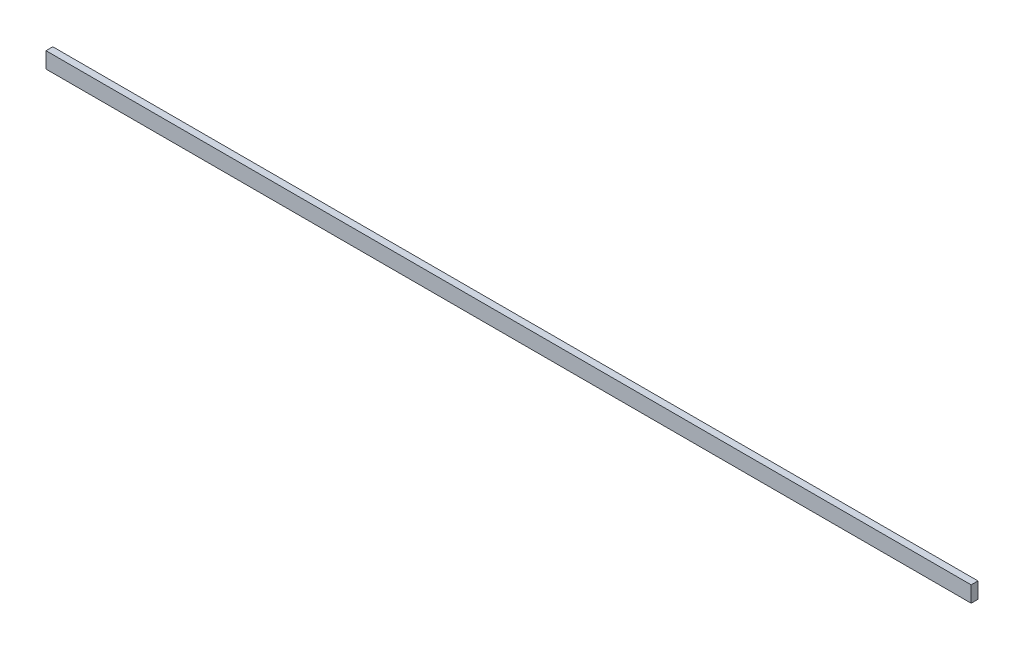
ISO-10303-21;
HEADER;
FILE_DESCRIPTION(('STEP AP214'),'2;1');
FILE_NAME('part.step','',(''),(''),'','','');
FILE_SCHEMA(('AUTOMOTIVE_DESIGN { 1 0 10303 214 1 1 1 1 }'));
ENDSEC;
DATA;
#1=APPLICATION_CONTEXT('core data for automotive mechanical design processes');
#2=APPLICATION_PROTOCOL_DEFINITION('international standard','automotive_design',2000,#1);
#3=PRODUCT_CONTEXT('',#1,'mechanical');
#4=PRODUCT('Part','Part','',(#3));
#5=PRODUCT_RELATED_PRODUCT_CATEGORY('part','',(#4));
#6=PRODUCT_DEFINITION_FORMATION('','',#4);
#7=PRODUCT_DEFINITION_CONTEXT('part definition',#1,'design');
#8=PRODUCT_DEFINITION('design','',#6,#7);
#9=PRODUCT_DEFINITION_SHAPE('','',#8);
#10=(LENGTH_UNIT() NAMED_UNIT(*) SI_UNIT(.MILLI.,.METRE.));
#11=(NAMED_UNIT(*) PLANE_ANGLE_UNIT() SI_UNIT($,.RADIAN.));
#12=(NAMED_UNIT(*) SI_UNIT($,.STERADIAN.) SOLID_ANGLE_UNIT());
#13=UNCERTAINTY_MEASURE_WITH_UNIT(LENGTH_MEASURE(1.E-05),#10,'distance_accuracy_value','');
#14=(GEOMETRIC_REPRESENTATION_CONTEXT(3) GLOBAL_UNCERTAINTY_ASSIGNED_CONTEXT((#13)) GLOBAL_UNIT_ASSIGNED_CONTEXT((#10,
#11,#12)) REPRESENTATION_CONTEXT('',''));
#15=CARTESIAN_POINT('',(0.,0.,0.));
#16=DIRECTION('',(0.,0.,1.));
#17=DIRECTION('',(1.,0.,0.));
#18=AXIS2_PLACEMENT_3D('',#15,#16,#17);
#19=CARTESIAN_POINT('',(5161.28,44.45,-19.05));
#20=DIRECTION('',(0.,-1.,0.));
#21=DIRECTION('',(0.,0.,-1.));
#22=AXIS2_PLACEMENT_3D('',#19,#20,#21);
#23=PLANE('',#22);
#24=DIRECTION('',(0.,0.,1.));
#25=VECTOR('',#24,1.);
#26=CARTESIAN_POINT('',(0.,44.45,-19.05));
#27=LINE('',#26,#25);
#28=CARTESIAN_POINT('',(0.,44.45,-19.05));
#29=VERTEX_POINT('',#28);
#30=CARTESIAN_POINT('',(0.,44.45,19.05));
#31=VERTEX_POINT('',#30);
#32=EDGE_CURVE('E102',#29,#31,#27,.T.);
#33=ORIENTED_EDGE('',*,*,#32,.T.);
#34=DIRECTION('',(-1.,0.,0.));
#35=VECTOR('',#34,1.);
#36=CARTESIAN_POINT('',(5161.28,44.45,19.05));
#37=LINE('',#36,#35);
#38=CARTESIAN_POINT('',(5161.28,44.45,19.05));
#39=VERTEX_POINT('',#38);
#40=EDGE_CURVE('E11',#39,#31,#37,.T.);
#41=ORIENTED_EDGE('',*,*,#40,.F.);
#42=DIRECTION('',(0.,0.,1.));
#43=VECTOR('',#42,1.);
#44=CARTESIAN_POINT('',(5161.28,44.45,-19.05));
#45=LINE('',#44,#43);
#46=CARTESIAN_POINT('',(5161.28,44.45,-19.05));
#47=VERTEX_POINT('',#46);
#48=EDGE_CURVE('E90',#47,#39,#45,.T.);
#49=ORIENTED_EDGE('',*,*,#48,.F.);
#50=DIRECTION('',(-1.,0.,0.));
#51=VECTOR('',#50,1.);
#52=CARTESIAN_POINT('',(5161.28,44.45,-19.05));
#53=LINE('',#52,#51);
#54=EDGE_CURVE('E98',#47,#29,#53,.T.);
#55=ORIENTED_EDGE('',*,*,#54,.T.);
#56=EDGE_LOOP('',(#33,#41,#49,#55));
#57=FACE_BOUND('',#56,.T.);
#58=ADVANCED_FACE('F39',(#57),#23,.F.);
#59=CARTESIAN_POINT('',(5161.28,-44.45,19.05));
#60=DIRECTION('',(0.,0.,-1.));
#61=DIRECTION('',(-1.,0.,0.));
#62=AXIS2_PLACEMENT_3D('',#59,#60,#61);
#63=PLANE('',#62);
#64=DIRECTION('',(0.,-1.,0.));
#65=VECTOR('',#64,1.);
#66=CARTESIAN_POINT('',(0.,-44.45,19.05));
#67=LINE('',#66,#65);
#68=CARTESIAN_POINT('',(0.,-44.45,19.05));
#69=VERTEX_POINT('',#68);
#70=EDGE_CURVE('E94',#31,#69,#67,.T.);
#71=ORIENTED_EDGE('',*,*,#70,.T.);
#72=DIRECTION('',(-1.,0.,0.));
#73=VECTOR('',#72,1.);
#74=CARTESIAN_POINT('',(5161.28,-44.45,19.05));
#75=LINE('',#74,#73);
#76=CARTESIAN_POINT('',(5161.28,-44.45,19.05));
#77=VERTEX_POINT('',#76);
#78=EDGE_CURVE('E47',#77,#69,#75,.T.);
#79=ORIENTED_EDGE('',*,*,#78,.F.);
#80=DIRECTION('',(0.,-1.,0.));
#81=VECTOR('',#80,1.);
#82=CARTESIAN_POINT('',(5161.28,-44.45,19.05));
#83=LINE('',#82,#81);
#84=EDGE_CURVE('E85',#39,#77,#83,.T.);
#85=ORIENTED_EDGE('',*,*,#84,.F.);
#86=ORIENTED_EDGE('',*,*,#40,.T.);
#87=EDGE_LOOP('',(#71,#79,#85,#86));
#88=FACE_BOUND('',#87,.T.);
#89=ADVANCED_FACE('F93',(#88),#63,.F.);
#90=CARTESIAN_POINT('',(5161.28,-44.45,-19.05));
#91=DIRECTION('',(0.,1.,0.));
#92=DIRECTION('',(0.,0.,1.));
#93=AXIS2_PLACEMENT_3D('',#90,#91,#92);
#94=PLANE('',#93);
#95=DIRECTION('',(0.,0.,-1.));
#96=VECTOR('',#95,1.);
#97=CARTESIAN_POINT('',(0.,-44.45,-19.05));
#98=LINE('',#97,#96);
#99=CARTESIAN_POINT('',(0.,-44.45,-19.05));
#100=VERTEX_POINT('',#99);
#101=EDGE_CURVE('E72',#69,#100,#98,.T.);
#102=ORIENTED_EDGE('',*,*,#101,.T.);
#103=DIRECTION('',(-1.,0.,0.));
#104=VECTOR('',#103,1.);
#105=CARTESIAN_POINT('',(5161.28,-44.45,-19.05));
#106=LINE('',#105,#104);
#107=CARTESIAN_POINT('',(5161.28,-44.45,-19.05));
#108=VERTEX_POINT('',#107);
#109=EDGE_CURVE('E95',#108,#100,#106,.T.);
#110=ORIENTED_EDGE('',*,*,#109,.F.);
#111=DIRECTION('',(0.,0.,-1.));
#112=VECTOR('',#111,1.);
#113=CARTESIAN_POINT('',(5161.28,-44.45,-19.05));
#114=LINE('',#113,#112);
#115=EDGE_CURVE('E88',#77,#108,#114,.T.);
#116=ORIENTED_EDGE('',*,*,#115,.F.);
#117=ORIENTED_EDGE('',*,*,#78,.T.);
#118=EDGE_LOOP('',(#102,#110,#116,#117));
#119=FACE_BOUND('',#118,.T.);
#120=ADVANCED_FACE('F96',(#119),#94,.F.);
#121=CARTESIAN_POINT('',(5161.28,-44.45,-19.05));
#122=DIRECTION('',(0.,0.,1.));
#123=DIRECTION('',(1.,0.,0.));
#124=AXIS2_PLACEMENT_3D('',#121,#122,#123);
#125=PLANE('',#124);
#126=DIRECTION('',(0.,1.,0.));
#127=VECTOR('',#126,1.);
#128=CARTESIAN_POINT('',(0.,-44.45,-19.05));
#129=LINE('',#128,#127);
#130=EDGE_CURVE('E78',#100,#29,#129,.T.);
#131=ORIENTED_EDGE('',*,*,#130,.T.);
#132=ORIENTED_EDGE('',*,*,#54,.F.);
#133=DIRECTION('',(0.,1.,0.));
#134=VECTOR('',#133,1.);
#135=CARTESIAN_POINT('',(5161.28,-44.45,-19.05));
#136=LINE('',#135,#134);
#137=EDGE_CURVE('E55',#108,#47,#136,.T.);
#138=ORIENTED_EDGE('',*,*,#137,.F.);
#139=ORIENTED_EDGE('',*,*,#109,.T.);
#140=EDGE_LOOP('',(#131,#132,#138,#139));
#141=FACE_BOUND('',#140,.T.);
#142=ADVANCED_FACE('F109',(#141),#125,.F.);
#143=CARTESIAN_POINT('',(5161.28,0.,0.));
#144=DIRECTION('',(-1.,0.,0.));
#145=DIRECTION('',(0.,0.,1.));
#146=AXIS2_PLACEMENT_3D('',#143,#144,#145);
#147=PLANE('',#146);
#148=ORIENTED_EDGE('',*,*,#48,.T.);
#149=ORIENTED_EDGE('',*,*,#84,.T.);
#150=ORIENTED_EDGE('',*,*,#115,.T.);
#151=ORIENTED_EDGE('',*,*,#137,.T.);
#152=EDGE_LOOP('',(#148,#149,#150,#151));
#153=FACE_BOUND('',#152,.T.);
#154=ADVANCED_FACE('F86',(#153),#147,.F.);
#155=CARTESIAN_POINT('',(0.,0.,0.));
#156=DIRECTION('',(-1.,0.,0.));
#157=DIRECTION('',(0.,0.,1.));
#158=AXIS2_PLACEMENT_3D('',#155,#156,#157);
#159=PLANE('',#158);
#160=ORIENTED_EDGE('',*,*,#32,.F.);
#161=ORIENTED_EDGE('',*,*,#130,.F.);
#162=ORIENTED_EDGE('',*,*,#101,.F.);
#163=ORIENTED_EDGE('',*,*,#70,.F.);
#164=EDGE_LOOP('',(#160,#161,#162,#163));
#165=FACE_BOUND('',#164,.T.);
#166=ADVANCED_FACE('F112',(#165),#159,.T.);
#167=CLOSED_SHELL('',(#58,#89,#120,#142,#154,#166));
#168=MANIFOLD_SOLID_BREP('B2',#167);
#169=ADVANCED_BREP_SHAPE_REPRESENTATION('',(#18,#168),#14);
#170=SHAPE_DEFINITION_REPRESENTATION(#9,#169);
ENDSEC;
END-ISO-10303-21;
